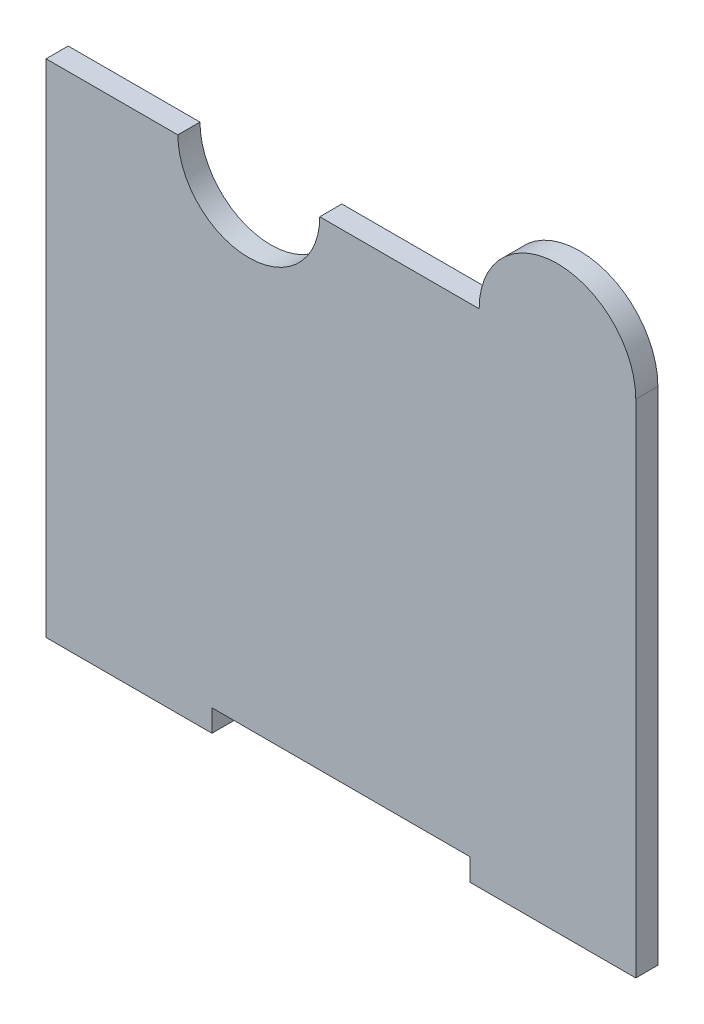
ISO-10303-21;
HEADER;
FILE_DESCRIPTION(('STEP AP214'),'2;1');
FILE_NAME('part.step','',(''),(''),'','','');
FILE_SCHEMA(('AUTOMOTIVE_DESIGN { 1 0 10303 214 1 1 1 1 }'));
ENDSEC;
DATA;
#1=APPLICATION_CONTEXT('core data for automotive mechanical design processes');
#2=APPLICATION_PROTOCOL_DEFINITION('international standard','automotive_design',2000,#1);
#3=PRODUCT_CONTEXT('',#1,'mechanical');
#4=PRODUCT('Part','Part','',(#3));
#5=PRODUCT_RELATED_PRODUCT_CATEGORY('part','',(#4));
#6=PRODUCT_DEFINITION_FORMATION('','',#4);
#7=PRODUCT_DEFINITION_CONTEXT('part definition',#1,'design');
#8=PRODUCT_DEFINITION('design','',#6,#7);
#9=PRODUCT_DEFINITION_SHAPE('','',#8);
#10=(LENGTH_UNIT() NAMED_UNIT(*) SI_UNIT(.MILLI.,.METRE.));
#11=(NAMED_UNIT(*) PLANE_ANGLE_UNIT() SI_UNIT($,.RADIAN.));
#12=(NAMED_UNIT(*) SI_UNIT($,.STERADIAN.) SOLID_ANGLE_UNIT());
#13=UNCERTAINTY_MEASURE_WITH_UNIT(LENGTH_MEASURE(1.E-05),#10,'distance_accuracy_value','');
#14=(GEOMETRIC_REPRESENTATION_CONTEXT(3) GLOBAL_UNCERTAINTY_ASSIGNED_CONTEXT((#13)) GLOBAL_UNIT_ASSIGNED_CONTEXT((#10,
#11,#12)) REPRESENTATION_CONTEXT('',''));
#15=CARTESIAN_POINT('',(0.,0.,0.));
#16=DIRECTION('',(0.,0.,1.));
#17=DIRECTION('',(1.,0.,0.));
#18=AXIS2_PLACEMENT_3D('',#15,#16,#17);
#19=CARTESIAN_POINT('',(83.75,0.,6.));
#20=DIRECTION('',(0.,0.,-1.));
#21=DIRECTION('',(-1.,0.,0.));
#22=AXIS2_PLACEMENT_3D('',#19,#20,#21);
#23=CYLINDRICAL_SURFACE('',#22,21.25);
#24=CARTESIAN_POINT('',(83.75,0.,0.));
#25=DIRECTION('',(0.,0.,1.));
#26=DIRECTION('',(1.,0.,0.));
#27=AXIS2_PLACEMENT_3D('',#24,#25,#26);
#28=CIRCLE('',#27,21.25);
#29=CARTESIAN_POINT('',(105.,0.,0.));
#30=VERTEX_POINT('',#29);
#31=CARTESIAN_POINT('',(62.5,0.,0.));
#32=VERTEX_POINT('',#31);
#33=EDGE_CURVE('E158',#30,#32,#28,.T.);
#34=ORIENTED_EDGE('',*,*,#33,.T.);
#35=DIRECTION('',(0.,0.,-1.));
#36=VECTOR('',#35,1.);
#37=CARTESIAN_POINT('',(62.5,0.,6.));
#38=LINE('',#37,#36);
#39=CARTESIAN_POINT('',(62.5,0.,6.));
#40=VERTEX_POINT('',#39);
#41=EDGE_CURVE('E11',#40,#32,#38,.T.);
#42=ORIENTED_EDGE('',*,*,#41,.F.);
#43=CARTESIAN_POINT('',(83.75,0.,6.));
#44=DIRECTION('',(0.,0.,1.));
#45=DIRECTION('',(1.,0.,0.));
#46=AXIS2_PLACEMENT_3D('',#43,#44,#45);
#47=CIRCLE('',#46,21.25);
#48=CARTESIAN_POINT('',(105.,0.,6.));
#49=VERTEX_POINT('',#48);
#50=EDGE_CURVE('E189',#49,#40,#47,.T.);
#51=ORIENTED_EDGE('',*,*,#50,.F.);
#52=DIRECTION('',(0.,0.,-1.));
#53=VECTOR('',#52,1.);
#54=CARTESIAN_POINT('',(105.,0.,6.));
#55=LINE('',#54,#53);
#56=EDGE_CURVE('E154',#49,#30,#55,.T.);
#57=ORIENTED_EDGE('',*,*,#56,.T.);
#58=EDGE_LOOP('',(#34,#42,#51,#57));
#59=FACE_BOUND('',#58,.T.);
#60=ADVANCED_FACE('F39',(#59),#23,.T.);
#61=CARTESIAN_POINT('',(19.25,0.,6.));
#62=DIRECTION('',(0.,-1.,0.));
#63=DIRECTION('',(1.,0.,0.));
#64=AXIS2_PLACEMENT_3D('',#61,#62,#63);
#65=PLANE('',#64);
#66=DIRECTION('',(-1.,0.,0.));
#67=VECTOR('',#66,1.);
#68=CARTESIAN_POINT('',(19.25,0.,0.));
#69=LINE('',#68,#67);
#70=CARTESIAN_POINT('',(19.25,0.,0.));
#71=VERTEX_POINT('',#70);
#72=EDGE_CURVE('E162',#32,#71,#69,.T.);
#73=ORIENTED_EDGE('',*,*,#72,.T.);
#74=DIRECTION('',(0.,0.,-1.));
#75=VECTOR('',#74,1.);
#76=CARTESIAN_POINT('',(19.25,0.,6.));
#77=LINE('',#76,#75);
#78=CARTESIAN_POINT('',(19.25,0.,6.));
#79=VERTEX_POINT('',#78);
#80=EDGE_CURVE('E48',#79,#71,#77,.T.);
#81=ORIENTED_EDGE('',*,*,#80,.F.);
#82=DIRECTION('',(-1.,0.,0.));
#83=VECTOR('',#82,1.);
#84=CARTESIAN_POINT('',(19.25,0.,6.));
#85=LINE('',#84,#83);
#86=EDGE_CURVE('E108',#40,#79,#85,.T.);
#87=ORIENTED_EDGE('',*,*,#86,.F.);
#88=ORIENTED_EDGE('',*,*,#41,.T.);
#89=EDGE_LOOP('',(#73,#81,#87,#88));
#90=FACE_BOUND('',#89,.T.);
#91=ADVANCED_FACE('F275',(#90),#65,.F.);
#92=CARTESIAN_POINT('',(0.,0.,6.));
#93=DIRECTION('',(0.,0.,-1.));
#94=DIRECTION('',(-1.,0.,0.));
#95=AXIS2_PLACEMENT_3D('',#92,#93,#94);
#96=CYLINDRICAL_SURFACE('',#95,19.25);
#97=CARTESIAN_POINT('',(0.,0.,0.));
#98=DIRECTION('',(0.,0.,-1.));
#99=DIRECTION('',(1.,0.,0.));
#100=AXIS2_PLACEMENT_3D('',#97,#98,#99);
#101=CIRCLE('',#100,19.25);
#102=CARTESIAN_POINT('',(-19.25,0.,0.));
#103=VERTEX_POINT('',#102);
#104=EDGE_CURVE('E165',#71,#103,#101,.T.);
#105=ORIENTED_EDGE('',*,*,#104,.T.);
#106=DIRECTION('',(0.,0.,-1.));
#107=VECTOR('',#106,1.);
#108=CARTESIAN_POINT('',(-19.25,0.,6.));
#109=LINE('',#108,#107);
#110=CARTESIAN_POINT('',(-19.25,0.,6.));
#111=VERTEX_POINT('',#110);
#112=EDGE_CURVE('E212',#111,#103,#109,.T.);
#113=ORIENTED_EDGE('',*,*,#112,.F.);
#114=CARTESIAN_POINT('',(0.,0.,6.));
#115=DIRECTION('',(0.,0.,-1.));
#116=DIRECTION('',(1.,0.,0.));
#117=AXIS2_PLACEMENT_3D('',#114,#115,#116);
#118=CIRCLE('',#117,19.25);
#119=EDGE_CURVE('E222',#79,#111,#118,.T.);
#120=ORIENTED_EDGE('',*,*,#119,.F.);
#121=ORIENTED_EDGE('',*,*,#80,.T.);
#122=EDGE_LOOP('',(#105,#113,#120,#121));
#123=FACE_BOUND('',#122,.T.);
#124=ADVANCED_FACE('F220',(#123),#96,.F.);
#125=CARTESIAN_POINT('',(-55.,0.,6.));
#126=DIRECTION('',(0.,-1.,0.));
#127=DIRECTION('',(0.,0.,-1.));
#128=AXIS2_PLACEMENT_3D('',#125,#126,#127);
#129=PLANE('',#128);
#130=DIRECTION('',(-1.,0.,0.));
#131=VECTOR('',#130,1.);
#132=CARTESIAN_POINT('',(-55.,0.,0.));
#133=LINE('',#132,#131);
#134=CARTESIAN_POINT('',(-55.,0.,0.));
#135=VERTEX_POINT('',#134);
#136=EDGE_CURVE('E168',#103,#135,#133,.T.);
#137=ORIENTED_EDGE('',*,*,#136,.T.);
#138=DIRECTION('',(0.,0.,-1.));
#139=VECTOR('',#138,1.);
#140=CARTESIAN_POINT('',(-55.,0.,6.));
#141=LINE('',#140,#139);
#142=CARTESIAN_POINT('',(-55.,0.,6.));
#143=VERTEX_POINT('',#142);
#144=EDGE_CURVE('E208',#143,#135,#141,.T.);
#145=ORIENTED_EDGE('',*,*,#144,.F.);
#146=DIRECTION('',(-1.,0.,0.));
#147=VECTOR('',#146,1.);
#148=CARTESIAN_POINT('',(-55.,0.,6.));
#149=LINE('',#148,#147);
#150=EDGE_CURVE('E241',#111,#143,#149,.T.);
#151=ORIENTED_EDGE('',*,*,#150,.F.);
#152=ORIENTED_EDGE('',*,*,#112,.T.);
#153=EDGE_LOOP('',(#137,#145,#151,#152));
#154=FACE_BOUND('',#153,.T.);
#155=ADVANCED_FACE('F231',(#154),#129,.F.);
#156=CARTESIAN_POINT('',(-55.,0.,6.));
#157=DIRECTION('',(1.,0.,0.));
#158=DIRECTION('',(0.,1.,0.));
#159=AXIS2_PLACEMENT_3D('',#156,#157,#158);
#160=PLANE('',#159);
#161=DIRECTION('',(0.,-1.,0.));
#162=VECTOR('',#161,1.);
#163=CARTESIAN_POINT('',(-55.,0.,0.));
#164=LINE('',#163,#162);
#165=CARTESIAN_POINT('',(-55.,-136.,0.));
#166=VERTEX_POINT('',#165);
#167=EDGE_CURVE('E171',#135,#166,#164,.T.);
#168=ORIENTED_EDGE('',*,*,#167,.T.);
#169=DIRECTION('',(0.,0.,-1.));
#170=VECTOR('',#169,1.);
#171=CARTESIAN_POINT('',(-55.,-136.,6.));
#172=LINE('',#171,#170);
#173=CARTESIAN_POINT('',(-55.,-136.,6.));
#174=VERTEX_POINT('',#173);
#175=EDGE_CURVE('E204',#174,#166,#172,.T.);
#176=ORIENTED_EDGE('',*,*,#175,.F.);
#177=DIRECTION('',(0.,-1.,0.));
#178=VECTOR('',#177,1.);
#179=CARTESIAN_POINT('',(-55.,0.,6.));
#180=LINE('',#179,#178);
#181=EDGE_CURVE('E237',#143,#174,#180,.T.);
#182=ORIENTED_EDGE('',*,*,#181,.F.);
#183=ORIENTED_EDGE('',*,*,#144,.T.);
#184=EDGE_LOOP('',(#168,#176,#182,#183));
#185=FACE_BOUND('',#184,.T.);
#186=ADVANCED_FACE('F235',(#185),#160,.F.);
#187=CARTESIAN_POINT('',(-55.,-136.,6.));
#188=DIRECTION('',(0.,1.,0.));
#189=DIRECTION('',(0.,0.,1.));
#190=AXIS2_PLACEMENT_3D('',#187,#188,#189);
#191=PLANE('',#190);
#192=DIRECTION('',(1.,0.,0.));
#193=VECTOR('',#192,1.);
#194=CARTESIAN_POINT('',(-55.,-136.,0.));
#195=LINE('',#194,#193);
#196=CARTESIAN_POINT('',(-9.99999999999999,-136.,0.));
#197=VERTEX_POINT('',#196);
#198=EDGE_CURVE('E174',#166,#197,#195,.T.);
#199=ORIENTED_EDGE('',*,*,#198,.T.);
#200=DIRECTION('',(0.,0.,-1.));
#201=VECTOR('',#200,1.);
#202=CARTESIAN_POINT('',(-9.99999999999999,-136.,6.));
#203=LINE('',#202,#201);
#204=CARTESIAN_POINT('',(-9.99999999999999,-136.,6.));
#205=VERTEX_POINT('',#204);
#206=EDGE_CURVE('E200',#205,#197,#203,.T.);
#207=ORIENTED_EDGE('',*,*,#206,.F.);
#208=DIRECTION('',(1.,0.,0.));
#209=VECTOR('',#208,1.);
#210=CARTESIAN_POINT('',(-55.,-136.,6.));
#211=LINE('',#210,#209);
#212=EDGE_CURVE('E240',#174,#205,#211,.T.);
#213=ORIENTED_EDGE('',*,*,#212,.F.);
#214=ORIENTED_EDGE('',*,*,#175,.T.);
#215=EDGE_LOOP('',(#199,#207,#213,#214));
#216=FACE_BOUND('',#215,.T.);
#217=ADVANCED_FACE('F288',(#216),#191,.F.);
#218=CARTESIAN_POINT('',(-9.99999999999999,-130.,6.));
#219=DIRECTION('',(-1.,0.,0.));
#220=DIRECTION('',(0.,0.,1.));
#221=AXIS2_PLACEMENT_3D('',#218,#219,#220);
#222=PLANE('',#221);
#223=DIRECTION('',(0.,1.,0.));
#224=VECTOR('',#223,1.);
#225=CARTESIAN_POINT('',(-9.99999999999999,-130.,0.));
#226=LINE('',#225,#224);
#227=CARTESIAN_POINT('',(-9.99999999999999,-130.,0.));
#228=VERTEX_POINT('',#227);
#229=EDGE_CURVE('E177',#197,#228,#226,.T.);
#230=ORIENTED_EDGE('',*,*,#229,.T.);
#231=DIRECTION('',(0.,0.,-1.));
#232=VECTOR('',#231,1.);
#233=CARTESIAN_POINT('',(-9.99999999999999,-130.,6.));
#234=LINE('',#233,#232);
#235=CARTESIAN_POINT('',(-9.99999999999999,-130.,6.));
#236=VERTEX_POINT('',#235);
#237=EDGE_CURVE('E196',#236,#228,#234,.T.);
#238=ORIENTED_EDGE('',*,*,#237,.F.);
#239=DIRECTION('',(0.,1.,0.));
#240=VECTOR('',#239,1.);
#241=CARTESIAN_POINT('',(-9.99999999999999,-130.,6.));
#242=LINE('',#241,#240);
#243=EDGE_CURVE('E245',#205,#236,#242,.T.);
#244=ORIENTED_EDGE('',*,*,#243,.F.);
#245=ORIENTED_EDGE('',*,*,#206,.T.);
#246=EDGE_LOOP('',(#230,#238,#244,#245));
#247=FACE_BOUND('',#246,.T.);
#248=ADVANCED_FACE('F256',(#247),#222,.F.);
#249=CARTESIAN_POINT('',(60.,-130.,6.));
#250=DIRECTION('',(0.,1.,0.));
#251=DIRECTION('',(0.,0.,1.));
#252=AXIS2_PLACEMENT_3D('',#249,#250,#251);
#253=PLANE('',#252);
#254=DIRECTION('',(1.,0.,0.));
#255=VECTOR('',#254,1.);
#256=CARTESIAN_POINT('',(60.,-130.,0.));
#257=LINE('',#256,#255);
#258=CARTESIAN_POINT('',(60.,-130.,0.));
#259=VERTEX_POINT('',#258);
#260=EDGE_CURVE('E180',#228,#259,#257,.T.);
#261=ORIENTED_EDGE('',*,*,#260,.T.);
#262=DIRECTION('',(0.,0.,-1.));
#263=VECTOR('',#262,1.);
#264=CARTESIAN_POINT('',(60.,-130.,6.));
#265=LINE('',#264,#263);
#266=CARTESIAN_POINT('',(60.,-130.,6.));
#267=VERTEX_POINT('',#266);
#268=EDGE_CURVE('E147',#267,#259,#265,.T.);
#269=ORIENTED_EDGE('',*,*,#268,.F.);
#270=DIRECTION('',(1.,0.,0.));
#271=VECTOR('',#270,1.);
#272=CARTESIAN_POINT('',(60.,-130.,6.));
#273=LINE('',#272,#271);
#274=EDGE_CURVE('E136',#236,#267,#273,.T.);
#275=ORIENTED_EDGE('',*,*,#274,.F.);
#276=ORIENTED_EDGE('',*,*,#237,.T.);
#277=EDGE_LOOP('',(#261,#269,#275,#276));
#278=FACE_BOUND('',#277,.T.);
#279=ADVANCED_FACE('F260',(#278),#253,.F.);
#280=CARTESIAN_POINT('',(60.,-130.,6.));
#281=DIRECTION('',(1.,0.,0.));
#282=DIRECTION('',(0.,0.,-1.));
#283=AXIS2_PLACEMENT_3D('',#280,#281,#282);
#284=PLANE('',#283);
#285=DIRECTION('',(0.,-1.,0.));
#286=VECTOR('',#285,1.);
#287=CARTESIAN_POINT('',(60.,-130.,0.));
#288=LINE('',#287,#286);
#289=CARTESIAN_POINT('',(60.,-136.,0.));
#290=VERTEX_POINT('',#289);
#291=EDGE_CURVE('E145',#259,#290,#288,.T.);
#292=ORIENTED_EDGE('',*,*,#291,.T.);
#293=DIRECTION('',(0.,0.,-1.));
#294=VECTOR('',#293,1.);
#295=CARTESIAN_POINT('',(60.,-136.,6.));
#296=LINE('',#295,#294);
#297=CARTESIAN_POINT('',(60.,-136.,6.));
#298=VERTEX_POINT('',#297);
#299=EDGE_CURVE('E142',#298,#290,#296,.T.);
#300=ORIENTED_EDGE('',*,*,#299,.F.);
#301=DIRECTION('',(0.,-1.,0.));
#302=VECTOR('',#301,1.);
#303=CARTESIAN_POINT('',(60.,-130.,6.));
#304=LINE('',#303,#302);
#305=EDGE_CURVE('E130',#267,#298,#304,.T.);
#306=ORIENTED_EDGE('',*,*,#305,.F.);
#307=ORIENTED_EDGE('',*,*,#268,.T.);
#308=EDGE_LOOP('',(#292,#300,#306,#307));
#309=FACE_BOUND('',#308,.T.);
#310=ADVANCED_FACE('F143',(#309),#284,.F.);
#311=CARTESIAN_POINT('',(105.,-136.,6.));
#312=DIRECTION('',(0.,1.,0.));
#313=DIRECTION('',(0.,0.,1.));
#314=AXIS2_PLACEMENT_3D('',#311,#312,#313);
#315=PLANE('',#314);
#316=DIRECTION('',(1.,0.,0.));
#317=VECTOR('',#316,1.);
#318=CARTESIAN_POINT('',(105.,-136.,0.));
#319=LINE('',#318,#317);
#320=CARTESIAN_POINT('',(105.,-136.,0.));
#321=VERTEX_POINT('',#320);
#322=EDGE_CURVE('E94',#290,#321,#319,.T.);
#323=ORIENTED_EDGE('',*,*,#322,.T.);
#324=DIRECTION('',(0.,0.,-1.));
#325=VECTOR('',#324,1.);
#326=CARTESIAN_POINT('',(105.,-136.,6.));
#327=LINE('',#326,#325);
#328=CARTESIAN_POINT('',(105.,-136.,6.));
#329=VERTEX_POINT('',#328);
#330=EDGE_CURVE('E148',#329,#321,#327,.T.);
#331=ORIENTED_EDGE('',*,*,#330,.F.);
#332=DIRECTION('',(1.,0.,0.));
#333=VECTOR('',#332,1.);
#334=CARTESIAN_POINT('',(105.,-136.,6.));
#335=LINE('',#334,#333);
#336=EDGE_CURVE('E134',#298,#329,#335,.T.);
#337=ORIENTED_EDGE('',*,*,#336,.F.);
#338=ORIENTED_EDGE('',*,*,#299,.T.);
#339=EDGE_LOOP('',(#323,#331,#337,#338));
#340=FACE_BOUND('',#339,.T.);
#341=ADVANCED_FACE('F150',(#340),#315,.F.);
#342=CARTESIAN_POINT('',(105.,0.,6.));
#343=DIRECTION('',(-1.,0.,0.));
#344=DIRECTION('',(0.,-1.,0.));
#345=AXIS2_PLACEMENT_3D('',#342,#343,#344);
#346=PLANE('',#345);
#347=DIRECTION('',(0.,1.,0.));
#348=VECTOR('',#347,1.);
#349=CARTESIAN_POINT('',(105.,0.,0.));
#350=LINE('',#349,#348);
#351=EDGE_CURVE('E100',#321,#30,#350,.T.);
#352=ORIENTED_EDGE('',*,*,#351,.T.);
#353=ORIENTED_EDGE('',*,*,#56,.F.);
#354=DIRECTION('',(0.,1.,0.));
#355=VECTOR('',#354,1.);
#356=CARTESIAN_POINT('',(105.,0.,6.));
#357=LINE('',#356,#355);
#358=EDGE_CURVE('E56',#329,#49,#357,.T.);
#359=ORIENTED_EDGE('',*,*,#358,.F.);
#360=ORIENTED_EDGE('',*,*,#330,.T.);
#361=EDGE_LOOP('',(#352,#353,#359,#360));
#362=FACE_BOUND('',#361,.T.);
#363=ADVANCED_FACE('F264',(#362),#346,.F.);
#364=CARTESIAN_POINT('',(83.75,0.,6.));
#365=DIRECTION('',(0.,0.,1.));
#366=DIRECTION('',(1.,0.,0.));
#367=AXIS2_PLACEMENT_3D('',#364,#365,#366);
#368=PLANE('',#367);
#369=ORIENTED_EDGE('',*,*,#50,.T.);
#370=ORIENTED_EDGE('',*,*,#86,.T.);
#371=ORIENTED_EDGE('',*,*,#119,.T.);
#372=ORIENTED_EDGE('',*,*,#150,.T.);
#373=ORIENTED_EDGE('',*,*,#181,.T.);
#374=ORIENTED_EDGE('',*,*,#212,.T.);
#375=ORIENTED_EDGE('',*,*,#243,.T.);
#376=ORIENTED_EDGE('',*,*,#274,.T.);
#377=ORIENTED_EDGE('',*,*,#305,.T.);
#378=ORIENTED_EDGE('',*,*,#336,.T.);
#379=ORIENTED_EDGE('',*,*,#358,.T.);
#380=EDGE_LOOP('',(#369,#370,#371,#372,#373,#374,#375,#376,#377,#378,#379));
#381=FACE_BOUND('',#380,.T.);
#382=ADVANCED_FACE('F132',(#381),#368,.T.);
#383=CARTESIAN_POINT('',(83.75,0.,0.));
#384=DIRECTION('',(0.,0.,1.));
#385=DIRECTION('',(1.,0.,0.));
#386=AXIS2_PLACEMENT_3D('',#383,#384,#385);
#387=PLANE('',#386);
#388=ORIENTED_EDGE('',*,*,#33,.F.);
#389=ORIENTED_EDGE('',*,*,#351,.F.);
#390=ORIENTED_EDGE('',*,*,#322,.F.);
#391=ORIENTED_EDGE('',*,*,#291,.F.);
#392=ORIENTED_EDGE('',*,*,#260,.F.);
#393=ORIENTED_EDGE('',*,*,#229,.F.);
#394=ORIENTED_EDGE('',*,*,#198,.F.);
#395=ORIENTED_EDGE('',*,*,#167,.F.);
#396=ORIENTED_EDGE('',*,*,#136,.F.);
#397=ORIENTED_EDGE('',*,*,#104,.F.);
#398=ORIENTED_EDGE('',*,*,#72,.F.);
#399=EDGE_LOOP('',(#388,#389,#390,#391,#392,#393,#394,#395,#396,#397,#398));
#400=FACE_BOUND('',#399,.T.);
#401=ADVANCED_FACE('F226',(#400),#387,.F.);
#402=CLOSED_SHELL('',(#60,#91,#124,#155,#186,#217,#248,#279,#310,#341,#363,#382,#401));
#403=MANIFOLD_SOLID_BREP('B2',#402);
#404=ADVANCED_BREP_SHAPE_REPRESENTATION('',(#18,#403),#14);
#405=SHAPE_DEFINITION_REPRESENTATION(#9,#404);
ENDSEC;
END-ISO-10303-21;
